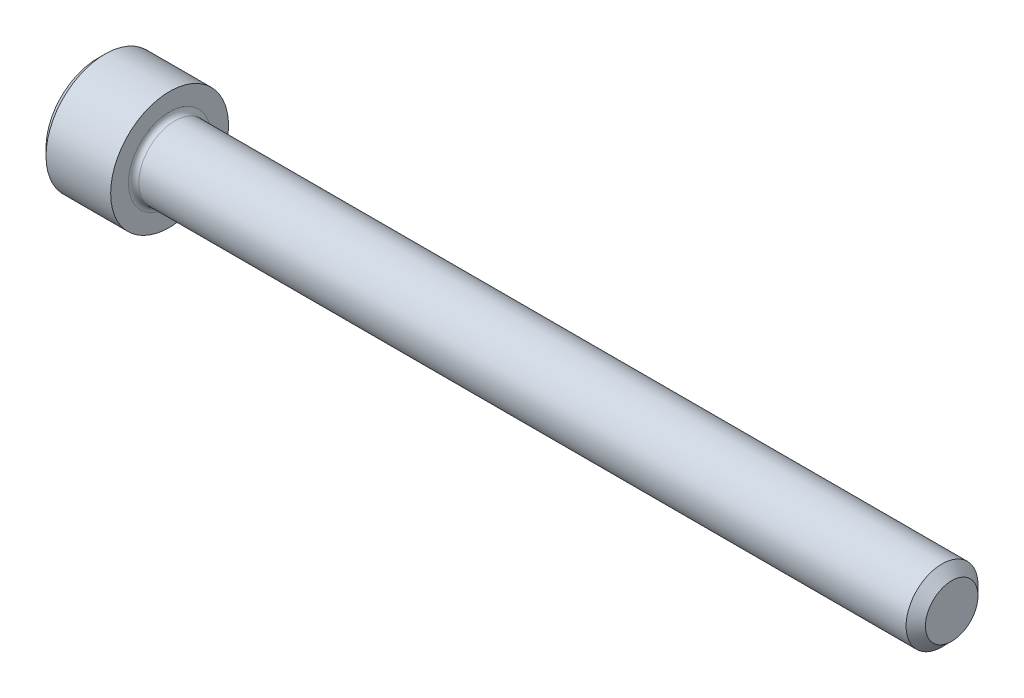
ISO-10303-21;
HEADER;
FILE_DESCRIPTION(('STEP AP214'),'2;1');
FILE_NAME('part.step','',(''),(''),'','','');
FILE_SCHEMA(('AUTOMOTIVE_DESIGN { 1 0 10303 214 1 1 1 1 }'));
ENDSEC;
DATA;
#1=APPLICATION_CONTEXT('core data for automotive mechanical design processes');
#2=APPLICATION_PROTOCOL_DEFINITION('international standard','automotive_design',2000,#1);
#3=PRODUCT_CONTEXT('',#1,'mechanical');
#4=PRODUCT('Part','Part','',(#3));
#5=PRODUCT_RELATED_PRODUCT_CATEGORY('part','',(#4));
#6=PRODUCT_DEFINITION_FORMATION('','',#4);
#7=PRODUCT_DEFINITION_CONTEXT('part definition',#1,'design');
#8=PRODUCT_DEFINITION('design','',#6,#7);
#9=PRODUCT_DEFINITION_SHAPE('','',#8);
#10=(LENGTH_UNIT() NAMED_UNIT(*) SI_UNIT(.MILLI.,.METRE.));
#11=(NAMED_UNIT(*) PLANE_ANGLE_UNIT() SI_UNIT($,.RADIAN.));
#12=(NAMED_UNIT(*) SI_UNIT($,.STERADIAN.) SOLID_ANGLE_UNIT());
#13=UNCERTAINTY_MEASURE_WITH_UNIT(LENGTH_MEASURE(1.E-05),#10,'distance_accuracy_value','');
#14=(GEOMETRIC_REPRESENTATION_CONTEXT(3) GLOBAL_UNCERTAINTY_ASSIGNED_CONTEXT((#13)) GLOBAL_UNIT_ASSIGNED_CONTEXT((#10,
#11,#12)) REPRESENTATION_CONTEXT('',''));
#15=CARTESIAN_POINT('',(0.,0.,0.));
#16=DIRECTION('',(0.,0.,1.));
#17=DIRECTION('',(1.,0.,0.));
#18=AXIS2_PLACEMENT_3D('',#15,#16,#17);
#19=CARTESIAN_POINT('',(0.,0.,0.));
#20=DIRECTION('',(-1.,0.,0.));
#21=DIRECTION('',(0.,0.,1.));
#22=AXIS2_PLACEMENT_3D('',#19,#20,#21);
#23=PLANE('',#22);
#24=DIRECTION('',(0.,-0.499999999999999,0.866025403784439));
#25=VECTOR('',#24,1.);
#26=CARTESIAN_POINT('',(0.,1.5984519552784,0.));
#27=LINE('',#26,#25);
#28=CARTESIAN_POINT('',(0.,1.5984519552784,0.));
#29=VERTEX_POINT('',#28);
#30=CARTESIAN_POINT('',(0.,0.799225977639205,1.3843));
#31=VERTEX_POINT('',#30);
#32=EDGE_CURVE('E390',#29,#31,#27,.T.);
#33=ORIENTED_EDGE('',*,*,#32,.T.);
#34=DIRECTION('',(0.,1.,0.));
#35=VECTOR('',#34,1.);
#36=CARTESIAN_POINT('',(0.,-0.799225977639191,1.3843));
#37=LINE('',#36,#35);
#38=CARTESIAN_POINT('',(0.,-0.799225977639191,1.3843));
#39=VERTEX_POINT('',#38);
#40=EDGE_CURVE('E132',#39,#31,#37,.T.);
#41=ORIENTED_EDGE('',*,*,#40,.F.);
#42=DIRECTION('',(0.,-0.500000000000001,-0.866025403784438));
#43=VECTOR('',#42,1.);
#44=CARTESIAN_POINT('',(0.,-0.799225977639191,1.3843));
#45=LINE('',#44,#43);
#46=CARTESIAN_POINT('',(0.,-1.59845195527839,0.));
#47=VERTEX_POINT('',#46);
#48=EDGE_CURVE('E393',#39,#47,#45,.T.);
#49=ORIENTED_EDGE('',*,*,#48,.T.);
#50=DIRECTION('',(0.,0.499999999999999,-0.86602540378444));
#51=VECTOR('',#50,1.);
#52=CARTESIAN_POINT('',(0.,-1.59845195527839,0.));
#53=LINE('',#52,#51);
#54=CARTESIAN_POINT('',(0.,-0.799225977639196,-1.3843));
#55=VERTEX_POINT('',#54);
#56=EDGE_CURVE('E396',#47,#55,#53,.T.);
#57=ORIENTED_EDGE('',*,*,#56,.T.);
#58=DIRECTION('',(0.,-1.,0.));
#59=VECTOR('',#58,1.);
#60=CARTESIAN_POINT('',(0.,0.799225977639202,-1.3843));
#61=LINE('',#60,#59);
#62=CARTESIAN_POINT('',(0.,0.799225977639202,-1.3843));
#63=VERTEX_POINT('',#62);
#64=EDGE_CURVE('E399',#63,#55,#61,.T.);
#65=ORIENTED_EDGE('',*,*,#64,.F.);
#66=DIRECTION('',(0.,-0.500000000000001,-0.866025403784438));
#67=VECTOR('',#66,1.);
#68=CARTESIAN_POINT('',(0.,1.5984519552784,0.));
#69=LINE('',#68,#67);
#70=EDGE_CURVE('E127',#29,#63,#69,.T.);
#71=ORIENTED_EDGE('',*,*,#70,.F.);
#72=EDGE_LOOP('',(#33,#41,#49,#57,#65,#71));
#73=FACE_BOUND('',#72,.T.);
#74=CARTESIAN_POINT('',(0.,0.,0.));
#75=DIRECTION('',(-1.,0.,0.));
#76=DIRECTION('',(0.,0.,1.));
#77=AXIS2_PLACEMENT_3D('',#74,#75,#76);
#78=CIRCLE('',#77,2.51460000000001);
#79=CARTESIAN_POINT('',(0.,0.,2.51460000000001));
#80=VERTEX_POINT('',#79);
#81=EDGE_CURVE('E143',#80,#80,#78,.T.);
#82=ORIENTED_EDGE('',*,*,#81,.T.);
#83=EDGE_LOOP('',(#82));
#84=FACE_BOUND('',#83,.T.);
#85=ADVANCED_FACE('F36',(#73,#84),#23,.T.);
#86=CARTESIAN_POINT('',(41.6052,1.28016,0.));
#87=DIRECTION('',(1.,0.,0.));
#88=DIRECTION('',(0.,0.,-1.));
#89=AXIS2_PLACEMENT_3D('',#86,#87,#88);
#90=PLANE('',#89);
#91=CARTESIAN_POINT('',(41.6052,0.,0.));
#92=DIRECTION('',(-1.,0.,0.));
#93=DIRECTION('',(0.,0.,1.));
#94=AXIS2_PLACEMENT_3D('',#91,#92,#93);
#95=CIRCLE('',#94,1.28016);
#96=CARTESIAN_POINT('',(41.6052,0.,1.28016));
#97=VERTEX_POINT('',#96);
#98=EDGE_CURVE('E156',#97,#97,#95,.T.);
#99=ORIENTED_EDGE('',*,*,#98,.F.);
#100=EDGE_LOOP('',(#99));
#101=FACE_BOUND('',#100,.T.);
#102=ADVANCED_FACE('F177',(#101),#90,.T.);
#103=CARTESIAN_POINT('',(41.6052,0.,0.));
#104=DIRECTION('',(-1.,0.,0.));
#105=DIRECTION('',(0.,0.,1.));
#106=AXIS2_PLACEMENT_3D('',#103,#104,#105);
#107=CONICAL_SURFACE('',#106,1.28016,0.785398163397443);
#108=CARTESIAN_POINT('',(41.13276,0.,0.));
#109=DIRECTION('',(-1.,0.,0.));
#110=DIRECTION('',(0.,0.,1.));
#111=AXIS2_PLACEMENT_3D('',#108,#109,#110);
#112=CIRCLE('',#111,1.7526);
#113=CARTESIAN_POINT('',(41.13276,0.,1.7526));
#114=VERTEX_POINT('',#113);
#115=EDGE_CURVE('E153',#114,#114,#112,.T.);
#116=ORIENTED_EDGE('',*,*,#115,.F.);
#117=EDGE_LOOP('',(#116));
#118=FACE_BOUND('',#117,.T.);
#119=ORIENTED_EDGE('',*,*,#98,.T.);
#120=EDGE_LOOP('',(#119));
#121=FACE_BOUND('',#120,.T.);
#122=ADVANCED_FACE('F183',(#118,#121),#107,.T.);
#123=CARTESIAN_POINT('',(-31.75,0.,0.));
#124=DIRECTION('',(-1.,0.,0.));
#125=DIRECTION('',(0.,0.,1.));
#126=AXIS2_PLACEMENT_3D('',#123,#124,#125);
#127=CYLINDRICAL_SURFACE('',#126,1.7526);
#128=CARTESIAN_POINT('',(3.7592,0.,0.));
#129=DIRECTION('',(1.,0.,0.));
#130=DIRECTION('',(0.,0.,-1.));
#131=AXIS2_PLACEMENT_3D('',#128,#129,#130);
#132=CIRCLE('',#131,1.7526);
#133=CARTESIAN_POINT('',(3.7592,0.,-1.7526));
#134=VERTEX_POINT('',#133);
#135=EDGE_CURVE('E11',#134,#134,#132,.T.);
#136=ORIENTED_EDGE('',*,*,#135,.T.);
#137=EDGE_LOOP('',(#136));
#138=FACE_BOUND('',#137,.T.);
#139=ORIENTED_EDGE('',*,*,#115,.T.);
#140=EDGE_LOOP('',(#139));
#141=FACE_BOUND('',#140,.T.);
#142=ADVANCED_FACE('F194',(#138,#141),#127,.T.);
#143=CARTESIAN_POINT('',(3.5052,2.8702,0.));
#144=DIRECTION('',(1.,0.,0.));
#145=DIRECTION('',(0.,0.,-1.));
#146=AXIS2_PLACEMENT_3D('',#143,#144,#145);
#147=PLANE('',#146);
#148=CARTESIAN_POINT('',(3.5052,0.,0.));
#149=DIRECTION('',(1.,0.,0.));
#150=DIRECTION('',(0.,0.,-1.));
#151=AXIS2_PLACEMENT_3D('',#148,#149,#150);
#152=CIRCLE('',#151,2.0066);
#153=CARTESIAN_POINT('',(3.5052,0.,-2.0066));
#154=VERTEX_POINT('',#153);
#155=EDGE_CURVE('E44',#154,#154,#152,.F.);
#156=ORIENTED_EDGE('',*,*,#155,.T.);
#157=EDGE_LOOP('',(#156));
#158=FACE_BOUND('',#157,.T.);
#159=CARTESIAN_POINT('',(3.5052,0.,0.));
#160=DIRECTION('',(-1.,0.,0.));
#161=DIRECTION('',(0.,0.,1.));
#162=AXIS2_PLACEMENT_3D('',#159,#160,#161);
#163=CIRCLE('',#162,2.8702);
#164=CARTESIAN_POINT('',(3.5052,0.,2.8702));
#165=VERTEX_POINT('',#164);
#166=EDGE_CURVE('E150',#165,#165,#163,.T.);
#167=ORIENTED_EDGE('',*,*,#166,.F.);
#168=EDGE_LOOP('',(#167));
#169=FACE_BOUND('',#168,.T.);
#170=ADVANCED_FACE('F161',(#158,#169),#147,.T.);
#171=CARTESIAN_POINT('',(-31.75,0.,0.));
#172=DIRECTION('',(-1.,0.,0.));
#173=DIRECTION('',(0.,0.,1.));
#174=AXIS2_PLACEMENT_3D('',#171,#172,#173);
#175=CYLINDRICAL_SURFACE('',#174,2.8702);
#176=ORIENTED_EDGE('',*,*,#166,.T.);
#177=EDGE_LOOP('',(#176));
#178=FACE_BOUND('',#177,.T.);
#179=CARTESIAN_POINT('',(0.355600000000005,0.,0.));
#180=DIRECTION('',(-1.,0.,0.));
#181=DIRECTION('',(0.,0.,1.));
#182=AXIS2_PLACEMENT_3D('',#179,#180,#181);
#183=CIRCLE('',#182,2.8702);
#184=CARTESIAN_POINT('',(0.355600000000005,0.,2.8702));
#185=VERTEX_POINT('',#184);
#186=EDGE_CURVE('E147',#185,#185,#183,.T.);
#187=ORIENTED_EDGE('',*,*,#186,.F.);
#188=EDGE_LOOP('',(#187));
#189=FACE_BOUND('',#188,.T.);
#190=ADVANCED_FACE('F172',(#178,#189),#175,.T.);
#191=CARTESIAN_POINT('',(0.,0.,0.));
#192=DIRECTION('',(1.,0.,0.));
#193=DIRECTION('',(0.,0.,-1.));
#194=AXIS2_PLACEMENT_3D('',#191,#192,#193);
#195=CONICAL_SURFACE('',#194,2.51460000000001,0.785398163397436);
#196=ORIENTED_EDGE('',*,*,#186,.T.);
#197=EDGE_LOOP('',(#196));
#198=FACE_BOUND('',#197,.T.);
#199=ORIENTED_EDGE('',*,*,#81,.F.);
#200=EDGE_LOOP('',(#199));
#201=FACE_BOUND('',#200,.T.);
#202=ADVANCED_FACE('F165',(#198,#201),#195,.T.);
#203=CARTESIAN_POINT('',(3.7592,0.,0.));
#204=DIRECTION('',(1.,0.,0.));
#205=DIRECTION('',(0.,0.,-1.));
#206=AXIS2_PLACEMENT_3D('',#203,#204,#205);
#207=TOROIDAL_SURFACE('',#206,2.0066,0.254);
#208=ORIENTED_EDGE('',*,*,#135,.F.);
#209=EDGE_LOOP('',(#208));
#210=FACE_BOUND('',#209,.T.);
#211=ORIENTED_EDGE('',*,*,#155,.F.);
#212=EDGE_LOOP('',(#211));
#213=FACE_BOUND('',#212,.T.);
#214=ADVANCED_FACE('F38',(#210,#213),#207,.F.);
#215=CARTESIAN_POINT('',(1.6256,1.5984519552784,0.));
#216=DIRECTION('',(0.,-0.866025403784439,-0.499999999999999));
#217=DIRECTION('',(0.,0.499999999999999,-0.866025403784439));
#218=AXIS2_PLACEMENT_3D('',#215,#216,#217);
#219=PLANE('',#218);
#220=ORIENTED_EDGE('',*,*,#32,.F.);
#221=DIRECTION('',(-1.,0.,0.));
#222=VECTOR('',#221,1.);
#223=CARTESIAN_POINT('',(1.6256,1.5984519552784,0.));
#224=LINE('',#223,#222);
#225=CARTESIAN_POINT('',(1.6256,1.5984519552784,0.));
#226=VERTEX_POINT('',#225);
#227=EDGE_CURVE('E380',#226,#29,#224,.T.);
#228=ORIENTED_EDGE('',*,*,#227,.F.);
#229=DIRECTION('',(0.,-0.499999999999999,0.866025403784439));
#230=VECTOR('',#229,1.);
#231=CARTESIAN_POINT('',(1.6256,1.5984519552784,0.));
#232=LINE('',#231,#230);
#233=CARTESIAN_POINT('',(1.6256,1.1988389664588,0.692150000000001));
#234=VERTEX_POINT('',#233);
#235=EDGE_CURVE('E119',#226,#234,#232,.T.);
#236=ORIENTED_EDGE('',*,*,#235,.T.);
#237=CARTESIAN_POINT('',(1.6256,0.799225977639205,1.3843));
#238=VERTEX_POINT('',#237);
#239=EDGE_CURVE('E110',#234,#238,#232,.T.);
#240=ORIENTED_EDGE('',*,*,#239,.T.);
#241=DIRECTION('',(-1.,0.,0.));
#242=VECTOR('',#241,1.);
#243=CARTESIAN_POINT('',(1.6256,0.799225977639205,1.3843));
#244=LINE('',#243,#242);
#245=EDGE_CURVE('E124',#238,#31,#244,.T.);
#246=ORIENTED_EDGE('',*,*,#245,.T.);
#247=EDGE_LOOP('',(#220,#228,#236,#240,#246));
#248=FACE_BOUND('',#247,.T.);
#249=ADVANCED_FACE('F123',(#248),#219,.T.);
#250=CARTESIAN_POINT('',(1.6256,-0.799225977639191,1.3843));
#251=DIRECTION('',(0.,0.,1.));
#252=DIRECTION('',(0.,-1.,0.));
#253=AXIS2_PLACEMENT_3D('',#250,#251,#252);
#254=PLANE('',#253);
#255=ORIENTED_EDGE('',*,*,#40,.T.);
#256=ORIENTED_EDGE('',*,*,#245,.F.);
#257=DIRECTION('',(0.,1.,0.));
#258=VECTOR('',#257,1.);
#259=CARTESIAN_POINT('',(1.6256,-0.799225977639191,1.3843));
#260=LINE('',#259,#258);
#261=CARTESIAN_POINT('',(1.6256,0.,1.3843));
#262=VERTEX_POINT('',#261);
#263=EDGE_CURVE('E107',#262,#238,#260,.T.);
#264=ORIENTED_EDGE('',*,*,#263,.F.);
#265=CARTESIAN_POINT('',(1.6256,-0.799225977639191,1.3843));
#266=VERTEX_POINT('',#265);
#267=EDGE_CURVE('E118',#266,#262,#260,.T.);
#268=ORIENTED_EDGE('',*,*,#267,.F.);
#269=DIRECTION('',(-1.,0.,0.));
#270=VECTOR('',#269,1.);
#271=CARTESIAN_POINT('',(1.6256,-0.799225977639191,1.3843));
#272=LINE('',#271,#270);
#273=EDGE_CURVE('E134',#266,#39,#272,.T.);
#274=ORIENTED_EDGE('',*,*,#273,.T.);
#275=EDGE_LOOP('',(#255,#256,#264,#268,#274));
#276=FACE_BOUND('',#275,.T.);
#277=ADVANCED_FACE('F129',(#276),#254,.F.);
#278=CARTESIAN_POINT('',(1.6256,-0.799225977639191,1.3843));
#279=DIRECTION('',(0.,0.866025403784438,-0.500000000000001));
#280=DIRECTION('',(0.,0.500000000000001,0.866025403784438));
#281=AXIS2_PLACEMENT_3D('',#278,#279,#280);
#282=PLANE('',#281);
#283=ORIENTED_EDGE('',*,*,#48,.F.);
#284=ORIENTED_EDGE('',*,*,#273,.F.);
#285=DIRECTION('',(0.,-0.500000000000001,-0.866025403784438));
#286=VECTOR('',#285,1.);
#287=CARTESIAN_POINT('',(1.6256,-0.799225977639191,1.3843));
#288=LINE('',#287,#286);
#289=CARTESIAN_POINT('',(1.6256,-1.19883896645879,0.692149999999999));
#290=VERTEX_POINT('',#289);
#291=EDGE_CURVE('E419',#266,#290,#288,.T.);
#292=ORIENTED_EDGE('',*,*,#291,.T.);
#293=CARTESIAN_POINT('',(1.6256,-1.59845195527839,0.));
#294=VERTEX_POINT('',#293);
#295=EDGE_CURVE('E408',#290,#294,#288,.T.);
#296=ORIENTED_EDGE('',*,*,#295,.T.);
#297=DIRECTION('',(-1.,0.,0.));
#298=VECTOR('',#297,1.);
#299=CARTESIAN_POINT('',(1.6256,-1.59845195527839,0.));
#300=LINE('',#299,#298);
#301=EDGE_CURVE('E139',#294,#47,#300,.T.);
#302=ORIENTED_EDGE('',*,*,#301,.T.);
#303=EDGE_LOOP('',(#283,#284,#292,#296,#302));
#304=FACE_BOUND('',#303,.T.);
#305=ADVANCED_FACE('F271',(#304),#282,.T.);
#306=CARTESIAN_POINT('',(1.6256,-1.59845195527839,0.));
#307=DIRECTION('',(0.,0.866025403784439,0.499999999999999));
#308=DIRECTION('',(0.,-0.499999999999999,0.866025403784439));
#309=AXIS2_PLACEMENT_3D('',#306,#307,#308);
#310=PLANE('',#309);
#311=ORIENTED_EDGE('',*,*,#56,.F.);
#312=ORIENTED_EDGE('',*,*,#301,.F.);
#313=DIRECTION('',(0.,0.499999999999999,-0.86602540378444));
#314=VECTOR('',#313,1.);
#315=CARTESIAN_POINT('',(1.6256,-1.59845195527839,0.));
#316=LINE('',#315,#314);
#317=CARTESIAN_POINT('',(1.6256,-1.1988389664588,-0.692149999999996));
#318=VERTEX_POINT('',#317);
#319=EDGE_CURVE('E386',#294,#318,#316,.T.);
#320=ORIENTED_EDGE('',*,*,#319,.T.);
#321=CARTESIAN_POINT('',(1.6256,-0.799225977639196,-1.3843));
#322=VERTEX_POINT('',#321);
#323=EDGE_CURVE('E418',#318,#322,#316,.T.);
#324=ORIENTED_EDGE('',*,*,#323,.T.);
#325=DIRECTION('',(-1.,0.,0.));
#326=VECTOR('',#325,1.);
#327=CARTESIAN_POINT('',(1.6256,-0.799225977639196,-1.3843));
#328=LINE('',#327,#326);
#329=EDGE_CURVE('E379',#322,#55,#328,.T.);
#330=ORIENTED_EDGE('',*,*,#329,.T.);
#331=EDGE_LOOP('',(#311,#312,#320,#324,#330));
#332=FACE_BOUND('',#331,.T.);
#333=ADVANCED_FACE('F279',(#332),#310,.T.);
#334=CARTESIAN_POINT('',(1.6256,0.799225977639202,-1.3843));
#335=DIRECTION('',(0.,0.,-1.));
#336=DIRECTION('',(0.,1.,0.));
#337=AXIS2_PLACEMENT_3D('',#334,#335,#336);
#338=PLANE('',#337);
#339=ORIENTED_EDGE('',*,*,#64,.T.);
#340=ORIENTED_EDGE('',*,*,#329,.F.);
#341=DIRECTION('',(0.,-1.,0.));
#342=VECTOR('',#341,1.);
#343=CARTESIAN_POINT('',(1.6256,0.799225977639202,-1.3843));
#344=LINE('',#343,#342);
#345=CARTESIAN_POINT('',(1.6256,0.,-1.3843));
#346=VERTEX_POINT('',#345);
#347=EDGE_CURVE('E383',#346,#322,#344,.T.);
#348=ORIENTED_EDGE('',*,*,#347,.F.);
#349=CARTESIAN_POINT('',(1.6256,0.799225977639202,-1.3843));
#350=VERTEX_POINT('',#349);
#351=EDGE_CURVE('E51',#350,#346,#344,.T.);
#352=ORIENTED_EDGE('',*,*,#351,.F.);
#353=DIRECTION('',(-1.,0.,0.));
#354=VECTOR('',#353,1.);
#355=CARTESIAN_POINT('',(1.6256,0.799225977639202,-1.3843));
#356=LINE('',#355,#354);
#357=EDGE_CURVE('E376',#350,#63,#356,.T.);
#358=ORIENTED_EDGE('',*,*,#357,.T.);
#359=EDGE_LOOP('',(#339,#340,#348,#352,#358));
#360=FACE_BOUND('',#359,.T.);
#361=ADVANCED_FACE('F288',(#360),#338,.F.);
#362=CARTESIAN_POINT('',(1.6256,1.5984519552784,0.));
#363=DIRECTION('',(0.,0.866025403784438,-0.500000000000001));
#364=DIRECTION('',(0.,0.500000000000001,0.866025403784438));
#365=AXIS2_PLACEMENT_3D('',#362,#363,#364);
#366=PLANE('',#365);
#367=ORIENTED_EDGE('',*,*,#70,.T.);
#368=ORIENTED_EDGE('',*,*,#357,.F.);
#369=DIRECTION('',(0.,-0.500000000000001,-0.866025403784438));
#370=VECTOR('',#369,1.);
#371=CARTESIAN_POINT('',(1.6256,1.5984519552784,0.));
#372=LINE('',#371,#370);
#373=CARTESIAN_POINT('',(1.6256,1.1988389664588,-0.692150000000004));
#374=VERTEX_POINT('',#373);
#375=EDGE_CURVE('E366',#374,#350,#372,.T.);
#376=ORIENTED_EDGE('',*,*,#375,.F.);
#377=EDGE_CURVE('E372',#226,#374,#372,.T.);
#378=ORIENTED_EDGE('',*,*,#377,.F.);
#379=ORIENTED_EDGE('',*,*,#227,.T.);
#380=EDGE_LOOP('',(#367,#368,#376,#378,#379));
#381=FACE_BOUND('',#380,.T.);
#382=ADVANCED_FACE('F297',(#381),#366,.F.);
#383=CARTESIAN_POINT('',(1.6256,0.,2.7686));
#384=DIRECTION('',(1.,0.,0.));
#385=DIRECTION('',(0.,0.,-1.));
#386=AXIS2_PLACEMENT_3D('',#383,#384,#385);
#387=PLANE('',#386);
#388=ORIENTED_EDGE('',*,*,#347,.T.);
#389=ORIENTED_EDGE('',*,*,#323,.F.);
#390=CARTESIAN_POINT('',(1.6256,0.,0.));
#391=DIRECTION('',(-1.,0.,0.));
#392=DIRECTION('',(0.,0.,1.));
#393=AXIS2_PLACEMENT_3D('',#390,#391,#392);
#394=CIRCLE('',#393,1.3843);
#395=EDGE_CURVE('E414',#346,#318,#394,.T.);
#396=ORIENTED_EDGE('',*,*,#395,.F.);
#397=EDGE_LOOP('',(#388,#389,#396));
#398=FACE_BOUND('',#397,.T.);
#399=ADVANCED_FACE('F306',(#398),#387,.F.);
#400=ORIENTED_EDGE('',*,*,#319,.F.);
#401=ORIENTED_EDGE('',*,*,#295,.F.);
#402=EDGE_CURVE('E137',#318,#290,#394,.T.);
#403=ORIENTED_EDGE('',*,*,#402,.F.);
#404=EDGE_LOOP('',(#400,#401,#403));
#405=FACE_BOUND('',#404,.T.);
#406=ADVANCED_FACE('F315',(#405),#387,.F.);
#407=ORIENTED_EDGE('',*,*,#291,.F.);
#408=ORIENTED_EDGE('',*,*,#267,.T.);
#409=EDGE_CURVE('E133',#290,#262,#394,.T.);
#410=ORIENTED_EDGE('',*,*,#409,.F.);
#411=EDGE_LOOP('',(#407,#408,#410));
#412=FACE_BOUND('',#411,.T.);
#413=ADVANCED_FACE('F324',(#412),#387,.F.);
#414=ORIENTED_EDGE('',*,*,#263,.T.);
#415=ORIENTED_EDGE('',*,*,#239,.F.);
#416=EDGE_CURVE('E113',#262,#234,#394,.T.);
#417=ORIENTED_EDGE('',*,*,#416,.F.);
#418=EDGE_LOOP('',(#414,#415,#417));
#419=FACE_BOUND('',#418,.T.);
#420=ADVANCED_FACE('F109',(#419),#387,.F.);
#421=ORIENTED_EDGE('',*,*,#235,.F.);
#422=ORIENTED_EDGE('',*,*,#377,.T.);
#423=EDGE_CURVE('E144',#234,#374,#394,.T.);
#424=ORIENTED_EDGE('',*,*,#423,.F.);
#425=EDGE_LOOP('',(#421,#422,#424));
#426=FACE_BOUND('',#425,.T.);
#427=ADVANCED_FACE('F339',(#426),#387,.F.);
#428=ORIENTED_EDGE('',*,*,#375,.T.);
#429=ORIENTED_EDGE('',*,*,#351,.T.);
#430=EDGE_CURVE('E369',#374,#346,#394,.T.);
#431=ORIENTED_EDGE('',*,*,#430,.F.);
#432=EDGE_LOOP('',(#428,#429,#431));
#433=FACE_BOUND('',#432,.T.);
#434=ADVANCED_FACE('F254',(#433),#387,.F.);
#435=CARTESIAN_POINT('',(1.6256,0.,0.));
#436=DIRECTION('',(-1.,0.,0.));
#437=DIRECTION('',(0.,0.,1.));
#438=AXIS2_PLACEMENT_3D('',#435,#436,#437);
#439=CONICAL_SURFACE('',#438,1.3843,1.04719755119659);
#440=CARTESIAN_POINT('',(2.4248259776392,0.,0.));
#441=VERTEX_POINT('',#440);
#442=VERTEX_LOOP('',#441);
#443=FACE_BOUND('',#442,.T.);
#444=ORIENTED_EDGE('',*,*,#416,.T.);
#445=ORIENTED_EDGE('',*,*,#423,.T.);
#446=ORIENTED_EDGE('',*,*,#430,.T.);
#447=ORIENTED_EDGE('',*,*,#395,.T.);
#448=ORIENTED_EDGE('',*,*,#402,.T.);
#449=ORIENTED_EDGE('',*,*,#409,.T.);
#450=EDGE_LOOP('',(#444,#445,#446,#447,#448,#449));
#451=FACE_BOUND('',#450,.T.);
#452=ADVANCED_FACE('F187',(#443,#451),#439,.F.);
#453=CLOSED_SHELL('',(#85,#102,#122,#142,#170,#190,#202,#214,#249,#277,#305,#333,#361,#382,#399,
#406,#413,#420,#427,#434,#452));
#454=MANIFOLD_SOLID_BREP('B2',#453);
#455=ADVANCED_BREP_SHAPE_REPRESENTATION('',(#18,#454),#14);
#456=SHAPE_DEFINITION_REPRESENTATION(#9,#455);
ENDSEC;
END-ISO-10303-21;
